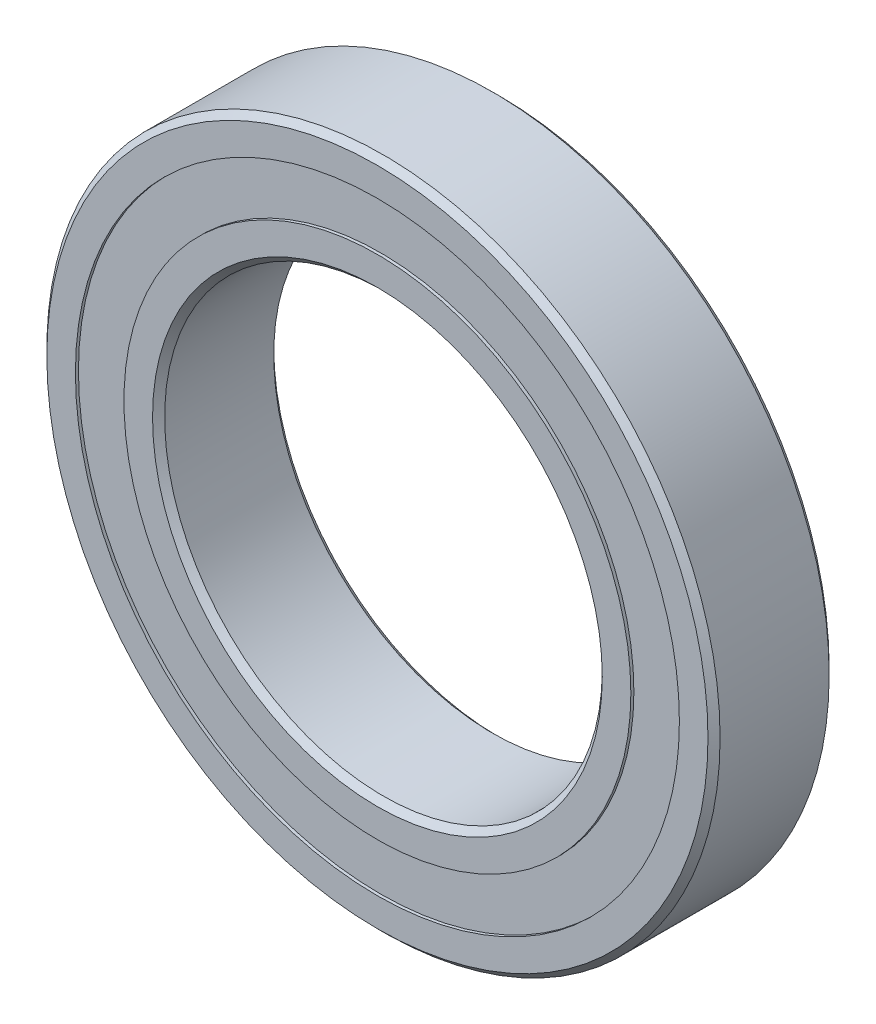
ISO-10303-21;
HEADER;
FILE_DESCRIPTION(('STEP AP214'),'2;1');
FILE_NAME('part.step','',(''),(''),'','','');
FILE_SCHEMA(('AUTOMOTIVE_DESIGN { 1 0 10303 214 1 1 1 1 }'));
ENDSEC;
DATA;
#1=APPLICATION_CONTEXT('core data for automotive mechanical design processes');
#2=APPLICATION_PROTOCOL_DEFINITION('international standard','automotive_design',2000,#1);
#3=PRODUCT_CONTEXT('',#1,'mechanical');
#4=PRODUCT('Part','Part','',(#3));
#5=PRODUCT_RELATED_PRODUCT_CATEGORY('part','',(#4));
#6=PRODUCT_DEFINITION_FORMATION('','',#4);
#7=PRODUCT_DEFINITION_CONTEXT('part definition',#1,'design');
#8=PRODUCT_DEFINITION('design','',#6,#7);
#9=PRODUCT_DEFINITION_SHAPE('','',#8);
#10=(LENGTH_UNIT() NAMED_UNIT(*) SI_UNIT(.MILLI.,.METRE.));
#11=(NAMED_UNIT(*) PLANE_ANGLE_UNIT() SI_UNIT($,.RADIAN.));
#12=(NAMED_UNIT(*) SI_UNIT($,.STERADIAN.) SOLID_ANGLE_UNIT());
#13=UNCERTAINTY_MEASURE_WITH_UNIT(LENGTH_MEASURE(1.E-05),#10,'distance_accuracy_value','');
#14=(GEOMETRIC_REPRESENTATION_CONTEXT(3) GLOBAL_UNCERTAINTY_ASSIGNED_CONTEXT((#13)) GLOBAL_UNIT_ASSIGNED_CONTEXT((#10,
#11,#12)) REPRESENTATION_CONTEXT('',''));
#15=CARTESIAN_POINT('',(0.,0.,0.));
#16=DIRECTION('',(0.,0.,1.));
#17=DIRECTION('',(1.,0.,0.));
#18=AXIS2_PLACEMENT_3D('',#15,#16,#17);
#19=CARTESIAN_POINT('',(0.,44.8543956043956,-8.55000000000001));
#20=DIRECTION('',(0.,0.,1.));
#21=DIRECTION('',(1.,0.,0.));
#22=AXIS2_PLACEMENT_3D('',#19,#20,#21);
#23=PLANE('',#22);
#24=CARTESIAN_POINT('',(0.,0.,-8.55000000000001));
#25=DIRECTION('',(0.,0.,1.));
#26=DIRECTION('',(1.,0.,0.));
#27=AXIS2_PLACEMENT_3D('',#24,#25,#26);
#28=CIRCLE('',#27,44.8543956043956);
#29=CARTESIAN_POINT('',(44.8543956043956,0.,-8.55000000000001));
#30=VERTEX_POINT('',#29);
#31=EDGE_CURVE('E55',#30,#30,#28,.T.);
#32=ORIENTED_EDGE('',*,*,#31,.F.);
#33=EDGE_LOOP('',(#32));
#34=FACE_BOUND('',#33,.T.);
#35=CARTESIAN_POINT('',(0.,0.,-8.55000000000001));
#36=DIRECTION('',(0.,0.,1.));
#37=DIRECTION('',(1.,0.,0.));
#38=AXIS2_PLACEMENT_3D('',#35,#36,#37);
#39=CIRCLE('',#38,37.6456043956044);
#40=CARTESIAN_POINT('',(37.6456043956044,0.,-8.55000000000001));
#41=VERTEX_POINT('',#40);
#42=EDGE_CURVE('E11',#41,#41,#39,.T.);
#43=ORIENTED_EDGE('',*,*,#42,.T.);
#44=EDGE_LOOP('',(#43));
#45=FACE_BOUND('',#44,.T.);
#46=ADVANCED_FACE('F41',(#34,#45),#23,.F.);
#47=CARTESIAN_POINT('',(0.,0.,9.));
#48=DIRECTION('',(0.,0.,1.));
#49=DIRECTION('',(1.,0.,0.));
#50=AXIS2_PLACEMENT_3D('',#47,#48,#49);
#51=CYLINDRICAL_SURFACE('',#50,37.6456043956044);
#52=ORIENTED_EDGE('',*,*,#42,.F.);
#53=EDGE_LOOP('',(#52));
#54=FACE_BOUND('',#53,.T.);
#55=CARTESIAN_POINT('',(0.,0.,-5.38439111441455));
#56=DIRECTION('',(0.,0.,1.));
#57=DIRECTION('',(1.,0.,0.));
#58=AXIS2_PLACEMENT_3D('',#55,#56,#57);
#59=CIRCLE('',#58,37.6456043956044);
#60=CARTESIAN_POINT('',(37.6456043956044,0.,-5.38439111441455));
#61=VERTEX_POINT('',#60);
#62=EDGE_CURVE('E47',#61,#61,#59,.T.);
#63=ORIENTED_EDGE('',*,*,#62,.T.);
#64=EDGE_LOOP('',(#63));
#65=FACE_BOUND('',#64,.T.);
#66=ADVANCED_FACE('F64',(#54,#65),#51,.F.);
#67=CARTESIAN_POINT('',(0.,44.8543956043956,-5.38439111441455));
#68=DIRECTION('',(0.,0.,-1.));
#69=DIRECTION('',(-1.,0.,0.));
#70=AXIS2_PLACEMENT_3D('',#67,#68,#69);
#71=PLANE('',#70);
#72=ORIENTED_EDGE('',*,*,#62,.F.);
#73=EDGE_LOOP('',(#72));
#74=FACE_BOUND('',#73,.T.);
#75=CARTESIAN_POINT('',(0.,0.,-5.38439111441455));
#76=DIRECTION('',(0.,0.,1.));
#77=DIRECTION('',(1.,0.,0.));
#78=AXIS2_PLACEMENT_3D('',#75,#76,#77);
#79=CIRCLE('',#78,44.8543956043956);
#80=CARTESIAN_POINT('',(44.8543956043956,0.,-5.38439111441455));
#81=VERTEX_POINT('',#80);
#82=EDGE_CURVE('E51',#81,#81,#79,.T.);
#83=ORIENTED_EDGE('',*,*,#82,.T.);
#84=EDGE_LOOP('',(#83));
#85=FACE_BOUND('',#84,.T.);
#86=ADVANCED_FACE('F68',(#74,#85),#71,.F.);
#87=CARTESIAN_POINT('',(0.,0.,9.));
#88=DIRECTION('',(0.,0.,1.));
#89=DIRECTION('',(1.,0.,0.));
#90=AXIS2_PLACEMENT_3D('',#87,#88,#89);
#91=CYLINDRICAL_SURFACE('',#90,44.8543956043956);
#92=ORIENTED_EDGE('',*,*,#82,.F.);
#93=EDGE_LOOP('',(#92));
#94=FACE_BOUND('',#93,.T.);
#95=ORIENTED_EDGE('',*,*,#31,.T.);
#96=EDGE_LOOP('',(#95));
#97=FACE_BOUND('',#96,.T.);
#98=ADVANCED_FACE('F61',(#94,#97),#91,.T.);
#99=CLOSED_SHELL('',(#46,#66,#86,#98));
#100=MANIFOLD_SOLID_BREP('B2',#99);
#101=CARTESIAN_POINT('',(0.,44.8543956043956,8.55000000000001));
#102=DIRECTION('',(0.,0.,-1.));
#103=DIRECTION('',(-1.,0.,0.));
#104=AXIS2_PLACEMENT_3D('',#101,#102,#103);
#105=PLANE('',#104);
#106=CARTESIAN_POINT('',(0.,0.,8.55000000000001));
#107=DIRECTION('',(0.,0.,1.));
#108=DIRECTION('',(1.,0.,0.));
#109=AXIS2_PLACEMENT_3D('',#106,#107,#108);
#110=CIRCLE('',#109,37.6456043956044);
#111=CARTESIAN_POINT('',(37.6456043956044,0.,8.55000000000001));
#112=VERTEX_POINT('',#111);
#113=EDGE_CURVE('E40',#112,#112,#110,.T.);
#114=ORIENTED_EDGE('',*,*,#113,.F.);
#115=EDGE_LOOP('',(#114));
#116=FACE_BOUND('',#115,.T.);
#117=CARTESIAN_POINT('',(0.,0.,8.55000000000001));
#118=DIRECTION('',(0.,0.,1.));
#119=DIRECTION('',(1.,0.,0.));
#120=AXIS2_PLACEMENT_3D('',#117,#118,#119);
#121=CIRCLE('',#120,44.8543956043956);
#122=CARTESIAN_POINT('',(44.8543956043956,0.,8.55000000000001));
#123=VERTEX_POINT('',#122);
#124=EDGE_CURVE('E122',#123,#123,#121,.T.);
#125=ORIENTED_EDGE('',*,*,#124,.T.);
#126=EDGE_LOOP('',(#125));
#127=FACE_BOUND('',#126,.T.);
#128=ADVANCED_FACE('F108',(#116,#127),#105,.F.);
#129=CARTESIAN_POINT('',(0.,0.,9.));
#130=DIRECTION('',(0.,0.,1.));
#131=DIRECTION('',(1.,0.,0.));
#132=AXIS2_PLACEMENT_3D('',#129,#130,#131);
#133=CYLINDRICAL_SURFACE('',#132,37.6456043956044);
#134=CARTESIAN_POINT('',(0.,0.,5.38439111441454));
#135=DIRECTION('',(0.,0.,1.));
#136=DIRECTION('',(1.,0.,0.));
#137=AXIS2_PLACEMENT_3D('',#134,#135,#136);
#138=CIRCLE('',#137,37.6456043956044);
#139=CARTESIAN_POINT('',(37.6456043956044,0.,5.38439111441454));
#140=VERTEX_POINT('',#139);
#141=EDGE_CURVE('E114',#140,#140,#138,.T.);
#142=ORIENTED_EDGE('',*,*,#141,.F.);
#143=EDGE_LOOP('',(#142));
#144=FACE_BOUND('',#143,.T.);
#145=ORIENTED_EDGE('',*,*,#113,.T.);
#146=EDGE_LOOP('',(#145));
#147=FACE_BOUND('',#146,.T.);
#148=ADVANCED_FACE('F137',(#144,#147),#133,.F.);
#149=CARTESIAN_POINT('',(0.,44.8543956043956,5.38439111441454));
#150=DIRECTION('',(0.,0.,1.));
#151=DIRECTION('',(1.,0.,0.));
#152=AXIS2_PLACEMENT_3D('',#149,#150,#151);
#153=PLANE('',#152);
#154=CARTESIAN_POINT('',(0.,0.,5.38439111441455));
#155=DIRECTION('',(0.,0.,1.));
#156=DIRECTION('',(1.,0.,0.));
#157=AXIS2_PLACEMENT_3D('',#154,#155,#156);
#158=CIRCLE('',#157,44.8543956043956);
#159=CARTESIAN_POINT('',(44.8543956043956,0.,5.38439111441455));
#160=VERTEX_POINT('',#159);
#161=EDGE_CURVE('E118',#160,#160,#158,.T.);
#162=ORIENTED_EDGE('',*,*,#161,.F.);
#163=EDGE_LOOP('',(#162));
#164=FACE_BOUND('',#163,.T.);
#165=ORIENTED_EDGE('',*,*,#141,.T.);
#166=EDGE_LOOP('',(#165));
#167=FACE_BOUND('',#166,.T.);
#168=ADVANCED_FACE('F132',(#164,#167),#153,.F.);
#169=CARTESIAN_POINT('',(0.,0.,9.));
#170=DIRECTION('',(0.,0.,1.));
#171=DIRECTION('',(1.,0.,0.));
#172=AXIS2_PLACEMENT_3D('',#169,#170,#171);
#173=CYLINDRICAL_SURFACE('',#172,44.8543956043956);
#174=ORIENTED_EDGE('',*,*,#124,.F.);
#175=EDGE_LOOP('',(#174));
#176=FACE_BOUND('',#175,.T.);
#177=ORIENTED_EDGE('',*,*,#161,.T.);
#178=EDGE_LOOP('',(#177));
#179=FACE_BOUND('',#178,.T.);
#180=ADVANCED_FACE('F129',(#176,#179),#173,.T.);
#181=CLOSED_SHELL('',(#128,#148,#168,#180));
#182=MANIFOLD_SOLID_BREP('B6',#181);
#183=CARTESIAN_POINT('',(-20.6249999999995,35.7235479061084,0.));
#184=DIRECTION('',(0.,0.,1.));
#185=DIRECTION('',(-0.499999999999989,0.866025403784445,0.));
#186=AXIS2_PLACEMENT_3D('',#183,#184,#185);
#187=SPHERICAL_SURFACE('',#186,5.38439111441455);
#188=CARTESIAN_POINT('',(-20.6249999999995,35.7235479061084,5.38439111441454));
#189=VERTEX_POINT('',#188);
#190=VERTEX_LOOP('',#189);
#191=FACE_BOUND('',#190,.T.);
#192=ADVANCED_FACE('F175',(#191),#187,.T.);
#193=CLOSED_SHELL('',(#192));
#194=MANIFOLD_SOLID_BREP('B35',#193);
#195=CARTESIAN_POINT('',(-35.7235479061079,20.6250000000004,0.));
#196=DIRECTION('',(0.,0.,1.));
#197=DIRECTION('',(-0.866025403784433,0.50000000000001,0.));
#198=AXIS2_PLACEMENT_3D('',#195,#196,#197);
#199=SPHERICAL_SURFACE('',#198,5.38439111441455);
#200=CARTESIAN_POINT('',(-35.7235479061079,20.6250000000004,5.38439111441454));
#201=VERTEX_POINT('',#200);
#202=VERTEX_LOOP('',#201);
#203=FACE_BOUND('',#202,.T.);
#204=ADVANCED_FACE('F195',(#203),#199,.T.);
#205=CLOSED_SHELL('',(#204));
#206=MANIFOLD_SOLID_BREP('B104',#205);
#207=CARTESIAN_POINT('',(-41.25,4.32070815681838E-13,0.));
#208=DIRECTION('',(0.,0.,1.));
#209=DIRECTION('',(-1.,0.,0.));
#210=AXIS2_PLACEMENT_3D('',#207,#208,#209);
#211=SPHERICAL_SURFACE('',#210,5.38439111441455);
#212=CARTESIAN_POINT('',(-41.25,4.32070815681838E-13,5.38439111441454));
#213=VERTEX_POINT('',#212);
#214=VERTEX_LOOP('',#213);
#215=FACE_BOUND('',#214,.T.);
#216=ADVANCED_FACE('F215',(#215),#211,.T.);
#217=CLOSED_SHELL('',(#216));
#218=MANIFOLD_SOLID_BREP('B171',#217);
#219=CARTESIAN_POINT('',(-35.7235479061083,-20.6249999999997,0.));
#220=DIRECTION('',(0.,0.,1.));
#221=DIRECTION('',(-0.866025403784443,-0.499999999999992,0.));
#222=AXIS2_PLACEMENT_3D('',#219,#220,#221);
#223=SPHERICAL_SURFACE('',#222,5.38439111441455);
#224=CARTESIAN_POINT('',(-35.7235479061083,-20.6249999999997,5.38439111441454));
#225=VERTEX_POINT('',#224);
#226=VERTEX_LOOP('',#225);
#227=FACE_BOUND('',#226,.T.);
#228=ADVANCED_FACE('F235',(#227),#223,.T.);
#229=CLOSED_SHELL('',(#228));
#230=MANIFOLD_SOLID_BREP('B191',#229);
#231=CARTESIAN_POINT('',(-20.6250000000003,-35.7235479061079,0.));
#232=DIRECTION('',(0.,0.,1.));
#233=DIRECTION('',(-0.500000000000007,-0.866025403784435,0.));
#234=AXIS2_PLACEMENT_3D('',#231,#232,#233);
#235=SPHERICAL_SURFACE('',#234,5.38439111441455);
#236=CARTESIAN_POINT('',(-20.6250000000003,-35.7235479061079,5.38439111441454));
#237=VERTEX_POINT('',#236);
#238=VERTEX_LOOP('',#237);
#239=FACE_BOUND('',#238,.T.);
#240=ADVANCED_FACE('F255',(#239),#235,.T.);
#241=CLOSED_SHELL('',(#240));
#242=MANIFOLD_SOLID_BREP('B211',#241);
#243=CARTESIAN_POINT('',(-2.88047210454558E-13,-41.25,0.));
#244=DIRECTION('',(0.,0.,1.));
#245=DIRECTION('',(0.,-1.,0.));
#246=AXIS2_PLACEMENT_3D('',#243,#244,#245);
#247=SPHERICAL_SURFACE('',#246,5.38439111441455);
#248=CARTESIAN_POINT('',(-2.88047210454558E-13,-41.25,5.38439111441454));
#249=VERTEX_POINT('',#248);
#250=VERTEX_LOOP('',#249);
#251=FACE_BOUND('',#250,.T.);
#252=ADVANCED_FACE('F275',(#251),#247,.T.);
#253=CLOSED_SHELL('',(#252));
#254=MANIFOLD_SOLID_BREP('B231',#253);
#255=CARTESIAN_POINT('',(20.6249999999998,-35.7235479061082,0.));
#256=DIRECTION('',(0.,0.,1.));
#257=DIRECTION('',(0.499999999999995,-0.866025403784442,0.));
#258=AXIS2_PLACEMENT_3D('',#255,#256,#257);
#259=SPHERICAL_SURFACE('',#258,5.38439111441455);
#260=CARTESIAN_POINT('',(20.6249999999998,-35.7235479061082,5.38439111441454));
#261=VERTEX_POINT('',#260);
#262=VERTEX_LOOP('',#261);
#263=FACE_BOUND('',#262,.T.);
#264=ADVANCED_FACE('F295',(#263),#259,.T.);
#265=CLOSED_SHELL('',(#264));
#266=MANIFOLD_SOLID_BREP('B251',#265);
#267=CARTESIAN_POINT('',(35.723547906108,-20.6250000000002,0.));
#268=DIRECTION('',(0.,0.,1.));
#269=DIRECTION('',(0.866025403784436,-0.500000000000004,0.));
#270=AXIS2_PLACEMENT_3D('',#267,#268,#269);
#271=SPHERICAL_SURFACE('',#270,5.38439111441455);
#272=CARTESIAN_POINT('',(35.723547906108,-20.6250000000002,5.38439111441454));
#273=VERTEX_POINT('',#272);
#274=VERTEX_LOOP('',#273);
#275=FACE_BOUND('',#274,.T.);
#276=ADVANCED_FACE('F315',(#275),#271,.T.);
#277=CLOSED_SHELL('',(#276));
#278=MANIFOLD_SOLID_BREP('B271',#277);
#279=CARTESIAN_POINT('',(41.25,-1.44023605227279E-13,0.));
#280=DIRECTION('',(0.,0.,1.));
#281=DIRECTION('',(1.,0.,0.));
#282=AXIS2_PLACEMENT_3D('',#279,#280,#281);
#283=SPHERICAL_SURFACE('',#282,5.38439111441455);
#284=CARTESIAN_POINT('',(41.25,-1.44023605227279E-13,5.38439111441454));
#285=VERTEX_POINT('',#284);
#286=VERTEX_LOOP('',#285);
#287=FACE_BOUND('',#286,.T.);
#288=ADVANCED_FACE('F335',(#287),#283,.T.);
#289=CLOSED_SHELL('',(#288));
#290=MANIFOLD_SOLID_BREP('B291',#289);
#291=CARTESIAN_POINT('',(35.7235479061081,20.6249999999999,0.));
#292=DIRECTION('',(0.,0.,1.));
#293=DIRECTION('',(0.86602540378444,0.499999999999998,0.));
#294=AXIS2_PLACEMENT_3D('',#291,#292,#293);
#295=SPHERICAL_SURFACE('',#294,5.38439111441455);
#296=CARTESIAN_POINT('',(35.7235479061081,20.6249999999999,5.38439111441454));
#297=VERTEX_POINT('',#296);
#298=VERTEX_LOOP('',#297);
#299=FACE_BOUND('',#298,.T.);
#300=ADVANCED_FACE('F355',(#299),#295,.T.);
#301=CLOSED_SHELL('',(#300));
#302=MANIFOLD_SOLID_BREP('B311',#301);
#303=CARTESIAN_POINT('',(20.625,35.7235479061081,0.));
#304=DIRECTION('',(0.,0.,1.));
#305=DIRECTION('',(0.500000000000001,0.866025403784438,0.));
#306=AXIS2_PLACEMENT_3D('',#303,#304,#305);
#307=SPHERICAL_SURFACE('',#306,5.38439111441455);
#308=CARTESIAN_POINT('',(20.625,35.7235479061081,5.38439111441454));
#309=VERTEX_POINT('',#308);
#310=VERTEX_LOOP('',#309);
#311=FACE_BOUND('',#310,.T.);
#312=ADVANCED_FACE('F375',(#311),#307,.T.);
#313=CLOSED_SHELL('',(#312));
#314=MANIFOLD_SOLID_BREP('B331',#313);
#315=CARTESIAN_POINT('',(0.,41.25,0.));
#316=DIRECTION('',(0.,0.,1.));
#317=DIRECTION('',(0.,1.,0.));
#318=AXIS2_PLACEMENT_3D('',#315,#316,#317);
#319=SPHERICAL_SURFACE('',#318,5.38439111441455);
#320=CARTESIAN_POINT('',(0.,41.25,5.38439111441454));
#321=VERTEX_POINT('',#320);
#322=VERTEX_LOOP('',#321);
#323=FACE_BOUND('',#322,.T.);
#324=ADVANCED_FACE('F397',(#323),#319,.T.);
#325=CLOSED_SHELL('',(#324));
#326=MANIFOLD_SOLID_BREP('B351',#325);
#327=CARTESIAN_POINT('',(0.,37.6456043956044,9.00000000000001));
#328=DIRECTION('',(0.,0.,-1.));
#329=DIRECTION('',(-1.,0.,0.));
#330=AXIS2_PLACEMENT_3D('',#327,#328,#329);
#331=PLANE('',#330);
#332=CARTESIAN_POINT('',(0.,0.,9.00000000000001));
#333=DIRECTION('',(0.,0.,1.));
#334=DIRECTION('',(1.,0.,0.));
#335=AXIS2_PLACEMENT_3D('',#332,#333,#334);
#336=CIRCLE('',#335,33.4);
#337=CARTESIAN_POINT('',(33.4,0.,9.00000000000001));
#338=VERTEX_POINT('',#337);
#339=EDGE_CURVE('E444',#338,#338,#336,.T.);
#340=ORIENTED_EDGE('',*,*,#339,.F.);
#341=EDGE_LOOP('',(#340));
#342=FACE_BOUND('',#341,.T.);
#343=CARTESIAN_POINT('',(0.,0.,9.00000000000001));
#344=DIRECTION('',(0.,0.,1.));
#345=DIRECTION('',(1.,0.,0.));
#346=AXIS2_PLACEMENT_3D('',#343,#344,#345);
#347=CIRCLE('',#346,37.6456043956044);
#348=CARTESIAN_POINT('',(37.6456043956044,0.,9.00000000000001));
#349=VERTEX_POINT('',#348);
#350=EDGE_CURVE('E396',#349,#349,#347,.T.);
#351=ORIENTED_EDGE('',*,*,#350,.T.);
#352=EDGE_LOOP('',(#351));
#353=FACE_BOUND('',#352,.T.);
#354=ADVANCED_FACE('F416',(#342,#353),#331,.F.);
#355=CARTESIAN_POINT('',(0.,0.,9.));
#356=DIRECTION('',(0.,0.,1.));
#357=DIRECTION('',(1.,0.,0.));
#358=AXIS2_PLACEMENT_3D('',#355,#356,#357);
#359=CYLINDRICAL_SURFACE('',#358,37.6456043956044);
#360=ORIENTED_EDGE('',*,*,#350,.F.);
#361=EDGE_LOOP('',(#360));
#362=FACE_BOUND('',#361,.T.);
#363=CARTESIAN_POINT('',(0.,0.,4.));
#364=DIRECTION('',(0.,0.,1.));
#365=DIRECTION('',(1.,0.,0.));
#366=AXIS2_PLACEMENT_3D('',#363,#364,#365);
#367=CIRCLE('',#366,37.6456043956044);
#368=CARTESIAN_POINT('',(37.6456043956044,0.,4.));
#369=VERTEX_POINT('',#368);
#370=EDGE_CURVE('E422',#369,#369,#367,.T.);
#371=ORIENTED_EDGE('',*,*,#370,.T.);
#372=EDGE_LOOP('',(#371));
#373=FACE_BOUND('',#372,.T.);
#374=ADVANCED_FACE('F451',(#362,#373),#359,.T.);
#375=CARTESIAN_POINT('',(0.,0.,0.));
#376=DIRECTION('',(0.,0.,1.));
#377=DIRECTION('',(1.,0.,0.));
#378=AXIS2_PLACEMENT_3D('',#375,#376,#377);
#379=TOROIDAL_SURFACE('',#378,41.25,5.38439111441454);
#380=ORIENTED_EDGE('',*,*,#370,.F.);
#381=EDGE_LOOP('',(#380));
#382=FACE_BOUND('',#381,.T.);
#383=CARTESIAN_POINT('',(0.,0.,-4.00000000000001));
#384=DIRECTION('',(0.,0.,1.));
#385=DIRECTION('',(1.,0.,0.));
#386=AXIS2_PLACEMENT_3D('',#383,#384,#385);
#387=CIRCLE('',#386,37.6456043956044);
#388=CARTESIAN_POINT('',(37.6456043956044,0.,-4.00000000000001));
#389=VERTEX_POINT('',#388);
#390=EDGE_CURVE('E426',#389,#389,#387,.T.);
#391=ORIENTED_EDGE('',*,*,#390,.T.);
#392=EDGE_LOOP('',(#391));
#393=FACE_BOUND('',#392,.T.);
#394=ADVANCED_FACE('F455',(#382,#393),#379,.F.);
#395=CARTESIAN_POINT('',(0.,0.,9.));
#396=DIRECTION('',(0.,0.,1.));
#397=DIRECTION('',(1.,0.,0.));
#398=AXIS2_PLACEMENT_3D('',#395,#396,#397);
#399=CYLINDRICAL_SURFACE('',#398,37.6456043956044);
#400=ORIENTED_EDGE('',*,*,#390,.F.);
#401=EDGE_LOOP('',(#400));
#402=FACE_BOUND('',#401,.T.);
#403=CARTESIAN_POINT('',(0.,0.,-9.00000000000001));
#404=DIRECTION('',(0.,0.,1.));
#405=DIRECTION('',(1.,0.,0.));
#406=AXIS2_PLACEMENT_3D('',#403,#404,#405);
#407=CIRCLE('',#406,37.6456043956044);
#408=CARTESIAN_POINT('',(37.6456043956044,0.,-9.00000000000001));
#409=VERTEX_POINT('',#408);
#410=EDGE_CURVE('E430',#409,#409,#407,.T.);
#411=ORIENTED_EDGE('',*,*,#410,.T.);
#412=EDGE_LOOP('',(#411));
#413=FACE_BOUND('',#412,.T.);
#414=ADVANCED_FACE('F460',(#402,#413),#399,.T.);
#415=CARTESIAN_POINT('',(0.,33.4,-9.00000000000001));
#416=DIRECTION('',(0.,0.,1.));
#417=DIRECTION('',(1.,0.,0.));
#418=AXIS2_PLACEMENT_3D('',#415,#416,#417);
#419=PLANE('',#418);
#420=ORIENTED_EDGE('',*,*,#410,.F.);
#421=EDGE_LOOP('',(#420));
#422=FACE_BOUND('',#421,.T.);
#423=CARTESIAN_POINT('',(0.,0.,-9.00000000000001));
#424=DIRECTION('',(0.,0.,1.));
#425=DIRECTION('',(1.,0.,0.));
#426=AXIS2_PLACEMENT_3D('',#423,#424,#425);
#427=CIRCLE('',#426,33.4);
#428=CARTESIAN_POINT('',(33.4,0.,-9.00000000000001));
#429=VERTEX_POINT('',#428);
#430=EDGE_CURVE('E435',#429,#429,#427,.T.);
#431=ORIENTED_EDGE('',*,*,#430,.T.);
#432=EDGE_LOOP('',(#431));
#433=FACE_BOUND('',#432,.T.);
#434=ADVANCED_FACE('F466',(#422,#433),#419,.F.);
#435=CARTESIAN_POINT('',(0.,0.,-8.1));
#436=DIRECTION('',(0.,0.,-1.));
#437=DIRECTION('',(-1.,0.,0.));
#438=AXIS2_PLACEMENT_3D('',#435,#436,#437);
#439=CONICAL_SURFACE('',#438,32.5,0.785398163397446);
#440=ORIENTED_EDGE('',*,*,#430,.F.);
#441=EDGE_LOOP('',(#440));
#442=FACE_BOUND('',#441,.T.);
#443=CARTESIAN_POINT('',(0.,0.,-8.1));
#444=DIRECTION('',(0.,0.,1.));
#445=DIRECTION('',(1.,0.,0.));
#446=AXIS2_PLACEMENT_3D('',#443,#444,#445);
#447=CIRCLE('',#446,32.5);
#448=CARTESIAN_POINT('',(32.5,0.,-8.1));
#449=VERTEX_POINT('',#448);
#450=EDGE_CURVE('E438',#449,#449,#447,.T.);
#451=ORIENTED_EDGE('',*,*,#450,.T.);
#452=EDGE_LOOP('',(#451));
#453=FACE_BOUND('',#452,.T.);
#454=ADVANCED_FACE('F470',(#442,#453),#439,.F.);
#455=CARTESIAN_POINT('',(0.,0.,9.));
#456=DIRECTION('',(0.,0.,1.));
#457=DIRECTION('',(1.,0.,0.));
#458=AXIS2_PLACEMENT_3D('',#455,#456,#457);
#459=CYLINDRICAL_SURFACE('',#458,32.5);
#460=ORIENTED_EDGE('',*,*,#450,.F.);
#461=EDGE_LOOP('',(#460));
#462=FACE_BOUND('',#461,.T.);
#463=CARTESIAN_POINT('',(0.,0.,8.1));
#464=DIRECTION('',(0.,0.,1.));
#465=DIRECTION('',(1.,0.,0.));
#466=AXIS2_PLACEMENT_3D('',#463,#464,#465);
#467=CIRCLE('',#466,32.5);
#468=CARTESIAN_POINT('',(32.5,0.,8.1));
#469=VERTEX_POINT('',#468);
#470=EDGE_CURVE('E441',#469,#469,#467,.T.);
#471=ORIENTED_EDGE('',*,*,#470,.T.);
#472=EDGE_LOOP('',(#471));
#473=FACE_BOUND('',#472,.T.);
#474=ADVANCED_FACE('F474',(#462,#473),#459,.F.);
#475=CARTESIAN_POINT('',(0.,0.,9.00000000000001));
#476=DIRECTION('',(0.,0.,1.));
#477=DIRECTION('',(1.,0.,0.));
#478=AXIS2_PLACEMENT_3D('',#475,#476,#477);
#479=CONICAL_SURFACE('',#478,33.4,0.78539816339745);
#480=ORIENTED_EDGE('',*,*,#470,.F.);
#481=EDGE_LOOP('',(#480));
#482=FACE_BOUND('',#481,.T.);
#483=ORIENTED_EDGE('',*,*,#339,.T.);
#484=EDGE_LOOP('',(#483));
#485=FACE_BOUND('',#484,.T.);
#486=ADVANCED_FACE('F448',(#482,#485),#479,.F.);
#487=CLOSED_SHELL('',(#354,#374,#394,#414,#434,#454,#474,#486));
#488=MANIFOLD_SOLID_BREP('B371',#487);
#489=CARTESIAN_POINT('',(0.,0.,8.10000000000001));
#490=DIRECTION('',(0.,0.,-1.));
#491=DIRECTION('',(-1.,0.,0.));
#492=AXIS2_PLACEMENT_3D('',#489,#490,#491);
#493=CONICAL_SURFACE('',#492,50.,0.785398163397451);
#494=CARTESIAN_POINT('',(0.,0.,9.00000000000001));
#495=DIRECTION('',(0.,0.,1.));
#496=DIRECTION('',(1.,0.,0.));
#497=AXIS2_PLACEMENT_3D('',#494,#495,#496);
#498=CIRCLE('',#497,49.1);
#499=CARTESIAN_POINT('',(49.1,0.,9.00000000000001));
#500=VERTEX_POINT('',#499);
#501=EDGE_CURVE('E565',#500,#500,#498,.T.);
#502=ORIENTED_EDGE('',*,*,#501,.F.);
#503=EDGE_LOOP('',(#502));
#504=FACE_BOUND('',#503,.T.);
#505=CARTESIAN_POINT('',(0.,0.,8.10000000000001));
#506=DIRECTION('',(0.,0.,1.));
#507=DIRECTION('',(1.,0.,0.));
#508=AXIS2_PLACEMENT_3D('',#505,#506,#507);
#509=CIRCLE('',#508,50.);
#510=CARTESIAN_POINT('',(50.,0.,8.10000000000001));
#511=VERTEX_POINT('',#510);
#512=EDGE_CURVE('E415',#511,#511,#509,.T.);
#513=ORIENTED_EDGE('',*,*,#512,.T.);
#514=EDGE_LOOP('',(#513));
#515=FACE_BOUND('',#514,.T.);
#516=ADVANCED_FACE('F537',(#504,#515),#493,.T.);
#517=CARTESIAN_POINT('',(0.,0.,9.));
#518=DIRECTION('',(0.,0.,1.));
#519=DIRECTION('',(1.,0.,0.));
#520=AXIS2_PLACEMENT_3D('',#517,#518,#519);
#521=CYLINDRICAL_SURFACE('',#520,50.);
#522=ORIENTED_EDGE('',*,*,#512,.F.);
#523=EDGE_LOOP('',(#522));
#524=FACE_BOUND('',#523,.T.);
#525=CARTESIAN_POINT('',(0.,0.,-8.1));
#526=DIRECTION('',(0.,0.,1.));
#527=DIRECTION('',(1.,0.,0.));
#528=AXIS2_PLACEMENT_3D('',#525,#526,#527);
#529=CIRCLE('',#528,50.);
#530=CARTESIAN_POINT('',(50.,0.,-8.1));
#531=VERTEX_POINT('',#530);
#532=EDGE_CURVE('E543',#531,#531,#529,.T.);
#533=ORIENTED_EDGE('',*,*,#532,.T.);
#534=EDGE_LOOP('',(#533));
#535=FACE_BOUND('',#534,.T.);
#536=ADVANCED_FACE('F572',(#524,#535),#521,.T.);
#537=CARTESIAN_POINT('',(0.,0.,-9.00000000000001));
#538=DIRECTION('',(0.,0.,1.));
#539=DIRECTION('',(1.,0.,0.));
#540=AXIS2_PLACEMENT_3D('',#537,#538,#539);
#541=CONICAL_SURFACE('',#540,49.1,0.78539816339745);
#542=ORIENTED_EDGE('',*,*,#532,.F.);
#543=EDGE_LOOP('',(#542));
#544=FACE_BOUND('',#543,.T.);
#545=CARTESIAN_POINT('',(0.,0.,-9.00000000000001));
#546=DIRECTION('',(0.,0.,1.));
#547=DIRECTION('',(1.,0.,0.));
#548=AXIS2_PLACEMENT_3D('',#545,#546,#547);
#549=CIRCLE('',#548,49.1);
#550=CARTESIAN_POINT('',(49.1,0.,-9.00000000000001));
#551=VERTEX_POINT('',#550);
#552=EDGE_CURVE('E547',#551,#551,#549,.T.);
#553=ORIENTED_EDGE('',*,*,#552,.T.);
#554=EDGE_LOOP('',(#553));
#555=FACE_BOUND('',#554,.T.);
#556=ADVANCED_FACE('F576',(#544,#555),#541,.T.);
#557=CARTESIAN_POINT('',(0.,49.1,-9.00000000000001));
#558=DIRECTION('',(0.,0.,1.));
#559=DIRECTION('',(1.,0.,0.));
#560=AXIS2_PLACEMENT_3D('',#557,#558,#559);
#561=PLANE('',#560);
#562=ORIENTED_EDGE('',*,*,#552,.F.);
#563=EDGE_LOOP('',(#562));
#564=FACE_BOUND('',#563,.T.);
#565=CARTESIAN_POINT('',(0.,0.,-9.00000000000001));
#566=DIRECTION('',(0.,0.,1.));
#567=DIRECTION('',(1.,0.,0.));
#568=AXIS2_PLACEMENT_3D('',#565,#566,#567);
#569=CIRCLE('',#568,44.8543956043956);
#570=CARTESIAN_POINT('',(44.8543956043956,0.,-9.00000000000001));
#571=VERTEX_POINT('',#570);
#572=EDGE_CURVE('E551',#571,#571,#569,.T.);
#573=ORIENTED_EDGE('',*,*,#572,.T.);
#574=EDGE_LOOP('',(#573));
#575=FACE_BOUND('',#574,.T.);
#576=ADVANCED_FACE('F581',(#564,#575),#561,.F.);
#577=CARTESIAN_POINT('',(0.,0.,9.));
#578=DIRECTION('',(0.,0.,1.));
#579=DIRECTION('',(1.,0.,0.));
#580=AXIS2_PLACEMENT_3D('',#577,#578,#579);
#581=CYLINDRICAL_SURFACE('',#580,44.8543956043956);
#582=ORIENTED_EDGE('',*,*,#572,.F.);
#583=EDGE_LOOP('',(#582));
#584=FACE_BOUND('',#583,.T.);
#585=CARTESIAN_POINT('',(0.,0.,-4.));
#586=DIRECTION('',(0.,0.,1.));
#587=DIRECTION('',(1.,0.,0.));
#588=AXIS2_PLACEMENT_3D('',#585,#586,#587);
#589=CIRCLE('',#588,44.8543956043956);
#590=CARTESIAN_POINT('',(44.8543956043956,0.,-4.));
#591=VERTEX_POINT('',#590);
#592=EDGE_CURVE('E556',#591,#591,#589,.T.);
#593=ORIENTED_EDGE('',*,*,#592,.T.);
#594=EDGE_LOOP('',(#593));
#595=FACE_BOUND('',#594,.T.);
#596=ADVANCED_FACE('F587',(#584,#595),#581,.F.);
#597=CARTESIAN_POINT('',(0.,0.,0.));
#598=DIRECTION('',(0.,0.,1.));
#599=DIRECTION('',(1.,0.,0.));
#600=AXIS2_PLACEMENT_3D('',#597,#598,#599);
#601=TOROIDAL_SURFACE('',#600,41.25,5.38439111441455);
#602=ORIENTED_EDGE('',*,*,#592,.F.);
#603=EDGE_LOOP('',(#602));
#604=FACE_BOUND('',#603,.T.);
#605=CARTESIAN_POINT('',(0.,0.,4.));
#606=DIRECTION('',(0.,0.,1.));
#607=DIRECTION('',(1.,0.,0.));
#608=AXIS2_PLACEMENT_3D('',#605,#606,#607);
#609=CIRCLE('',#608,44.8543956043956);
#610=CARTESIAN_POINT('',(44.8543956043956,0.,4.));
#611=VERTEX_POINT('',#610);
#612=EDGE_CURVE('E559',#611,#611,#609,.T.);
#613=ORIENTED_EDGE('',*,*,#612,.T.);
#614=EDGE_LOOP('',(#613));
#615=FACE_BOUND('',#614,.T.);
#616=ADVANCED_FACE('F591',(#604,#615),#601,.F.);
#617=CARTESIAN_POINT('',(0.,0.,9.));
#618=DIRECTION('',(0.,0.,1.));
#619=DIRECTION('',(1.,0.,0.));
#620=AXIS2_PLACEMENT_3D('',#617,#618,#619);
#621=CYLINDRICAL_SURFACE('',#620,44.8543956043956);
#622=ORIENTED_EDGE('',*,*,#612,.F.);
#623=EDGE_LOOP('',(#622));
#624=FACE_BOUND('',#623,.T.);
#625=CARTESIAN_POINT('',(0.,0.,9.00000000000001));
#626=DIRECTION('',(0.,0.,1.));
#627=DIRECTION('',(1.,0.,0.));
#628=AXIS2_PLACEMENT_3D('',#625,#626,#627);
#629=CIRCLE('',#628,44.8543956043956);
#630=CARTESIAN_POINT('',(44.8543956043956,0.,9.00000000000001));
#631=VERTEX_POINT('',#630);
#632=EDGE_CURVE('E562',#631,#631,#629,.T.);
#633=ORIENTED_EDGE('',*,*,#632,.T.);
#634=EDGE_LOOP('',(#633));
#635=FACE_BOUND('',#634,.T.);
#636=ADVANCED_FACE('F595',(#624,#635),#621,.F.);
#637=CARTESIAN_POINT('',(0.,49.1,9.00000000000001));
#638=DIRECTION('',(0.,0.,-1.));
#639=DIRECTION('',(-1.,0.,0.));
#640=AXIS2_PLACEMENT_3D('',#637,#638,#639);
#641=PLANE('',#640);
#642=ORIENTED_EDGE('',*,*,#632,.F.);
#643=EDGE_LOOP('',(#642));
#644=FACE_BOUND('',#643,.T.);
#645=ORIENTED_EDGE('',*,*,#501,.T.);
#646=EDGE_LOOP('',(#645));
#647=FACE_BOUND('',#646,.T.);
#648=ADVANCED_FACE('F569',(#644,#647),#641,.F.);
#649=CLOSED_SHELL('',(#516,#536,#556,#576,#596,#616,#636,#648));
#650=MANIFOLD_SOLID_BREP('B391',#649);
#651=ADVANCED_BREP_SHAPE_REPRESENTATION('',(#18,#100,#182,#194,#206,#218,#230,#242,#254,#266,
#278,#290,#302,#314,#326,#488,#650),#14);
#652=SHAPE_DEFINITION_REPRESENTATION(#9,#651);
ENDSEC;
END-ISO-10303-21;
